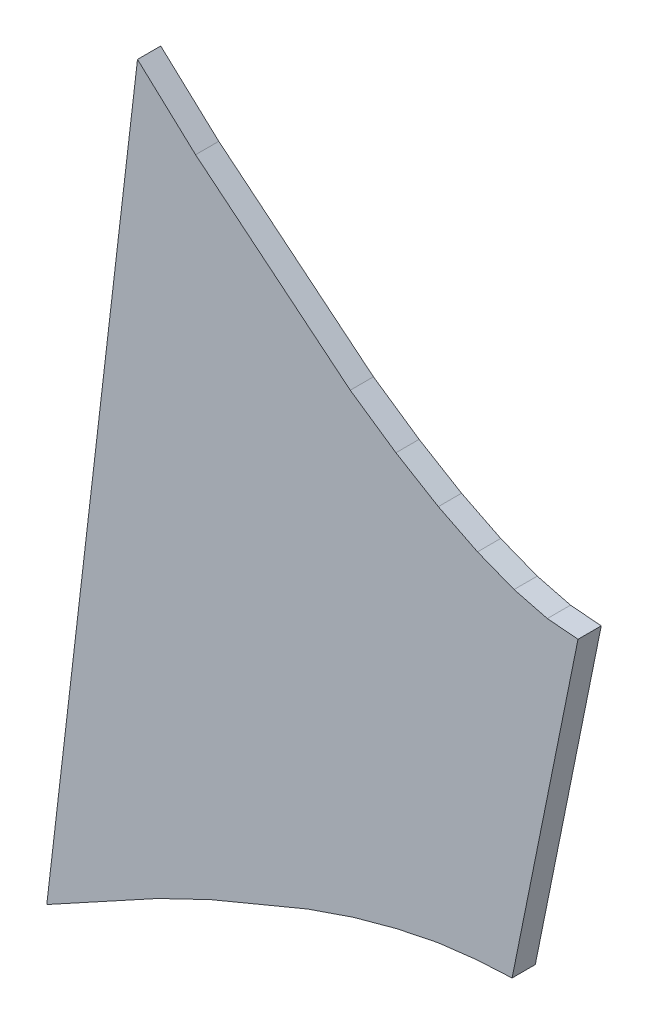
ISO-10303-21;
HEADER;
FILE_DESCRIPTION(('STEP AP214'),'2;1');
FILE_NAME('part.step','',(''),(''),'','','');
FILE_SCHEMA(('AUTOMOTIVE_DESIGN { 1 0 10303 214 1 1 1 1 }'));
ENDSEC;
DATA;
#1=APPLICATION_CONTEXT('core data for automotive mechanical design processes');
#2=APPLICATION_PROTOCOL_DEFINITION('international standard','automotive_design',2000,#1);
#3=PRODUCT_CONTEXT('',#1,'mechanical');
#4=PRODUCT('Part','Part','',(#3));
#5=PRODUCT_RELATED_PRODUCT_CATEGORY('part','',(#4));
#6=PRODUCT_DEFINITION_FORMATION('','',#4);
#7=PRODUCT_DEFINITION_CONTEXT('part definition',#1,'design');
#8=PRODUCT_DEFINITION('design','',#6,#7);
#9=PRODUCT_DEFINITION_SHAPE('','',#8);
#10=(LENGTH_UNIT() NAMED_UNIT(*) SI_UNIT(.MILLI.,.METRE.));
#11=(NAMED_UNIT(*) PLANE_ANGLE_UNIT() SI_UNIT($,.RADIAN.));
#12=(NAMED_UNIT(*) SI_UNIT($,.STERADIAN.) SOLID_ANGLE_UNIT());
#13=UNCERTAINTY_MEASURE_WITH_UNIT(LENGTH_MEASURE(1.E-05),#10,'distance_accuracy_value','');
#14=(GEOMETRIC_REPRESENTATION_CONTEXT(3) GLOBAL_UNCERTAINTY_ASSIGNED_CONTEXT((#13)) GLOBAL_UNIT_ASSIGNED_CONTEXT((#10,
#11,#12)) REPRESENTATION_CONTEXT('',''));
#15=CARTESIAN_POINT('',(0.,0.,0.));
#16=DIRECTION('',(0.,0.,1.));
#17=DIRECTION('',(1.,0.,0.));
#18=AXIS2_PLACEMENT_3D('',#15,#16,#17);
#19=CARTESIAN_POINT('',(95.0230026245117,96.8190002441406,0.));
#20=DIRECTION('',(-0.0847451700380124,-0.996402657641592,0.));
#21=DIRECTION('',(-0.996402657641592,0.0847451700380124,0.));
#22=AXIS2_PLACEMENT_3D('',#19,#20,#21);
#23=PLANE('',#22);
#24=DIRECTION('',(-0.996402657641592,0.0847451700380124,0.));
#25=VECTOR('',#24,1.);
#26=CARTESIAN_POINT('',(95.0230026245117,96.8190002441406,0.03556));
#27=LINE('',#26,#25);
#28=CARTESIAN_POINT('',(95.0230026245117,96.8190002441406,0.03556));
#29=VERTEX_POINT('',#28);
#30=CARTESIAN_POINT('',(94.9759979248047,96.822998046875,0.03556));
#31=VERTEX_POINT('',#30);
#32=EDGE_CURVE('E11',#29,#31,#27,.T.);
#33=ORIENTED_EDGE('',*,*,#32,.F.);
#34=DIRECTION('',(0.,0.,1.));
#35=VECTOR('',#34,1.);
#36=CARTESIAN_POINT('',(95.0230026245117,96.8190002441406,0.));
#37=LINE('',#36,#35);
#38=CARTESIAN_POINT('',(95.0230026245117,96.8190002441406,0.));
#39=VERTEX_POINT('',#38);
#40=EDGE_CURVE('E24',#39,#29,#37,.T.);
#41=ORIENTED_EDGE('',*,*,#40,.F.);
#42=DIRECTION('',(-0.996402657641592,0.0847451700380124,0.));
#43=VECTOR('',#42,1.);
#44=CARTESIAN_POINT('',(95.0230026245117,96.8190002441406,0.));
#45=LINE('',#44,#43);
#46=CARTESIAN_POINT('',(94.9759979248047,96.822998046875,0.));
#47=VERTEX_POINT('',#46);
#48=EDGE_CURVE('E160',#39,#47,#45,.T.);
#49=ORIENTED_EDGE('',*,*,#48,.T.);
#50=DIRECTION('',(0.,0.,1.));
#51=VECTOR('',#50,1.);
#52=CARTESIAN_POINT('',(94.9759979248047,96.822998046875,0.));
#53=LINE('',#52,#51);
#54=EDGE_CURVE('E37',#47,#31,#53,.T.);
#55=ORIENTED_EDGE('',*,*,#54,.T.);
#56=EDGE_LOOP('',(#33,#41,#49,#55));
#57=FACE_BOUND('',#56,.T.);
#58=ADVANCED_FACE('F17',(#57),#23,.F.);
#59=CARTESIAN_POINT('',(94.9759979248047,96.822998046875,0.));
#60=DIRECTION('',(-0.247035735310202,-0.96900637019565,0.));
#61=DIRECTION('',(-0.96900637019565,0.247035735310202,0.));
#62=AXIS2_PLACEMENT_3D('',#59,#60,#61);
#63=PLANE('',#62);
#64=DIRECTION('',(-0.96900637019565,0.247035735310202,0.));
#65=VECTOR('',#64,1.);
#66=CARTESIAN_POINT('',(94.9759979248047,96.822998046875,0.03556));
#67=LINE('',#66,#65);
#68=CARTESIAN_POINT('',(94.9250030517578,96.8359985351563,0.03556));
#69=VERTEX_POINT('',#68);
#70=EDGE_CURVE('E280',#31,#69,#67,.T.);
#71=ORIENTED_EDGE('',*,*,#70,.F.);
#72=ORIENTED_EDGE('',*,*,#54,.F.);
#73=DIRECTION('',(-0.96900637019565,0.247035735310202,0.));
#74=VECTOR('',#73,1.);
#75=CARTESIAN_POINT('',(94.9759979248047,96.822998046875,0.));
#76=LINE('',#75,#74);
#77=CARTESIAN_POINT('',(94.9250030517578,96.8359985351563,0.));
#78=VERTEX_POINT('',#77);
#79=EDGE_CURVE('E277',#47,#78,#76,.T.);
#80=ORIENTED_EDGE('',*,*,#79,.T.);
#81=DIRECTION('',(0.,0.,1.));
#82=VECTOR('',#81,1.);
#83=CARTESIAN_POINT('',(94.9250030517578,96.8359985351563,0.));
#84=LINE('',#83,#82);
#85=EDGE_CURVE('E275',#78,#69,#84,.T.);
#86=ORIENTED_EDGE('',*,*,#85,.T.);
#87=EDGE_LOOP('',(#71,#72,#80,#86));
#88=FACE_BOUND('',#87,.T.);
#89=ADVANCED_FACE('F288',(#88),#63,.F.);
#90=CARTESIAN_POINT('',(94.9250030517578,96.8359985351563,0.));
#91=DIRECTION('',(-0.365699450144398,-0.930732997246839,0.));
#92=DIRECTION('',(-0.930732997246839,0.365699450144398,0.));
#93=AXIS2_PLACEMENT_3D('',#90,#91,#92);
#94=PLANE('',#93);
#95=DIRECTION('',(-0.930732997246839,0.365699450144398,0.));
#96=VECTOR('',#95,1.);
#97=CARTESIAN_POINT('',(94.9250030517578,96.8359985351563,0.03556));
#98=LINE('',#97,#96);
#99=CARTESIAN_POINT('',(94.8690032958984,96.8580017089844,0.03556));
#100=VERTEX_POINT('',#99);
#101=EDGE_CURVE('E272',#69,#100,#98,.T.);
#102=ORIENTED_EDGE('',*,*,#101,.F.);
#103=ORIENTED_EDGE('',*,*,#85,.F.);
#104=DIRECTION('',(-0.930732997246839,0.365699450144398,0.));
#105=VECTOR('',#104,1.);
#106=CARTESIAN_POINT('',(94.9250030517578,96.8359985351563,0.));
#107=LINE('',#106,#105);
#108=CARTESIAN_POINT('',(94.8690032958984,96.8580017089844,0.));
#109=VERTEX_POINT('',#108);
#110=EDGE_CURVE('E269',#78,#109,#107,.T.);
#111=ORIENTED_EDGE('',*,*,#110,.T.);
#112=DIRECTION('',(0.,0.,1.));
#113=VECTOR('',#112,1.);
#114=CARTESIAN_POINT('',(94.8690032958984,96.8580017089844,0.));
#115=LINE('',#114,#113);
#116=EDGE_CURVE('E267',#109,#100,#115,.T.);
#117=ORIENTED_EDGE('',*,*,#116,.T.);
#118=EDGE_LOOP('',(#102,#103,#111,#117));
#119=FACE_BOUND('',#118,.T.);
#120=ADVANCED_FACE('F294',(#119),#94,.F.);
#121=CARTESIAN_POINT('',(94.8690032958984,96.8580017089844,0.));
#122=DIRECTION('',(-0.447168104778649,-0.894449934914566,0.));
#123=DIRECTION('',(-0.894449934914566,0.447168104778649,0.));
#124=AXIS2_PLACEMENT_3D('',#121,#122,#123);
#125=PLANE('',#124);
#126=DIRECTION('',(-0.894449934914566,0.447168104778649,0.));
#127=VECTOR('',#126,1.);
#128=CARTESIAN_POINT('',(94.8690032958984,96.8580017089844,0.03556));
#129=LINE('',#128,#127);
#130=CARTESIAN_POINT('',(94.8089981079102,96.8880004882812,0.03556));
#131=VERTEX_POINT('',#130);
#132=EDGE_CURVE('E264',#100,#131,#129,.T.);
#133=ORIENTED_EDGE('',*,*,#132,.F.);
#134=ORIENTED_EDGE('',*,*,#116,.F.);
#135=DIRECTION('',(-0.894449934914566,0.447168104778649,0.));
#136=VECTOR('',#135,1.);
#137=CARTESIAN_POINT('',(94.8690032958984,96.8580017089844,0.));
#138=LINE('',#137,#136);
#139=CARTESIAN_POINT('',(94.8089981079102,96.8880004882812,0.));
#140=VERTEX_POINT('',#139);
#141=EDGE_CURVE('E261',#109,#140,#138,.T.);
#142=ORIENTED_EDGE('',*,*,#141,.T.);
#143=DIRECTION('',(0.,0.,1.));
#144=VECTOR('',#143,1.);
#145=CARTESIAN_POINT('',(94.8089981079102,96.8880004882812,0.));
#146=LINE('',#145,#144);
#147=EDGE_CURVE('E259',#140,#131,#146,.T.);
#148=ORIENTED_EDGE('',*,*,#147,.T.);
#149=EDGE_LOOP('',(#133,#134,#142,#148));
#150=FACE_BOUND('',#149,.T.);
#151=ADVANCED_FACE('F296',(#150),#125,.F.);
#152=CARTESIAN_POINT('',(94.8089981079102,96.8880004882812,0.));
#153=DIRECTION('',(-0.514540160647674,-0.857466281016732,0.));
#154=DIRECTION('',(-0.857466281016732,0.514540160647674,0.));
#155=AXIS2_PLACEMENT_3D('',#152,#153,#154);
#156=PLANE('',#155);
#157=DIRECTION('',(-0.857466281016732,0.514540160647674,0.));
#158=VECTOR('',#157,1.);
#159=CARTESIAN_POINT('',(94.8089981079102,96.8880004882812,0.03556));
#160=LINE('',#159,#158);
#161=CARTESIAN_POINT('',(94.7440032958984,96.927001953125,0.03556));
#162=VERTEX_POINT('',#161);
#163=EDGE_CURVE('E256',#131,#162,#160,.T.);
#164=ORIENTED_EDGE('',*,*,#163,.F.);
#165=ORIENTED_EDGE('',*,*,#147,.F.);
#166=DIRECTION('',(-0.857466281016732,0.514540160647674,0.));
#167=VECTOR('',#166,1.);
#168=CARTESIAN_POINT('',(94.8089981079102,96.8880004882812,0.));
#169=LINE('',#168,#167);
#170=CARTESIAN_POINT('',(94.7440032958984,96.927001953125,0.));
#171=VERTEX_POINT('',#170);
#172=EDGE_CURVE('E253',#140,#171,#169,.T.);
#173=ORIENTED_EDGE('',*,*,#172,.T.);
#174=DIRECTION('',(0.,0.,1.));
#175=VECTOR('',#174,1.);
#176=CARTESIAN_POINT('',(94.7440032958984,96.927001953125,0.));
#177=LINE('',#176,#175);
#178=EDGE_CURVE('E251',#171,#162,#177,.T.);
#179=ORIENTED_EDGE('',*,*,#178,.T.);
#180=EDGE_LOOP('',(#164,#165,#173,#179));
#181=FACE_BOUND('',#180,.T.);
#182=ADVANCED_FACE('F301',(#181),#156,.F.);
#183=CARTESIAN_POINT('',(94.7440032958984,96.927001953125,0.));
#184=DIRECTION('',(-0.565502151713997,-0.824746819579705,0.));
#185=DIRECTION('',(-0.824746819579705,0.565502151713997,0.));
#186=AXIS2_PLACEMENT_3D('',#183,#184,#185);
#187=PLANE('',#186);
#188=DIRECTION('',(-0.824746819579705,0.565502151713997,0.));
#189=VECTOR('',#188,1.);
#190=CARTESIAN_POINT('',(94.7440032958984,96.927001953125,0.03556));
#191=LINE('',#190,#189);
#192=CARTESIAN_POINT('',(94.6740036010742,96.9749984741211,0.03556));
#193=VERTEX_POINT('',#192);
#194=EDGE_CURVE('E248',#162,#193,#191,.T.);
#195=ORIENTED_EDGE('',*,*,#194,.F.);
#196=ORIENTED_EDGE('',*,*,#178,.F.);
#197=DIRECTION('',(-0.824746819579705,0.565502151713997,0.));
#198=VECTOR('',#197,1.);
#199=CARTESIAN_POINT('',(94.7440032958984,96.927001953125,0.));
#200=LINE('',#199,#198);
#201=CARTESIAN_POINT('',(94.6740036010742,96.9749984741211,0.));
#202=VERTEX_POINT('',#201);
#203=EDGE_CURVE('E245',#171,#202,#200,.T.);
#204=ORIENTED_EDGE('',*,*,#203,.T.);
#205=DIRECTION('',(0.,0.,1.));
#206=VECTOR('',#205,1.);
#207=CARTESIAN_POINT('',(94.6740036010742,96.9749984741211,0.));
#208=LINE('',#207,#206);
#209=EDGE_CURVE('E243',#202,#193,#208,.T.);
#210=ORIENTED_EDGE('',*,*,#209,.T.);
#211=EDGE_LOOP('',(#195,#196,#204,#210));
#212=FACE_BOUND('',#211,.T.);
#213=ADVANCED_FACE('F304',(#212),#187,.F.);
#214=CARTESIAN_POINT('',(94.6740036010742,96.9749984741211,0.));
#215=DIRECTION('',(-0.633404621409799,-0.773820770964898,0.));
#216=DIRECTION('',(-0.773820770964898,0.633404621409799,0.));
#217=AXIS2_PLACEMENT_3D('',#214,#215,#216);
#218=PLANE('',#217);
#219=DIRECTION('',(-0.773820770964898,0.633404621409799,0.));
#220=VECTOR('',#219,1.);
#221=CARTESIAN_POINT('',(94.6740036010742,96.9749984741211,0.03556));
#222=LINE('',#221,#220);
#223=CARTESIAN_POINT('',(94.4369964599609,97.1689987182617,0.03556));
#224=VERTEX_POINT('',#223);
#225=EDGE_CURVE('E240',#193,#224,#222,.T.);
#226=ORIENTED_EDGE('',*,*,#225,.F.);
#227=ORIENTED_EDGE('',*,*,#209,.F.);
#228=DIRECTION('',(-0.773820770964898,0.633404621409799,0.));
#229=VECTOR('',#228,1.);
#230=CARTESIAN_POINT('',(94.6740036010742,96.9749984741211,0.));
#231=LINE('',#230,#229);
#232=CARTESIAN_POINT('',(94.4369964599609,97.1689987182617,0.));
#233=VERTEX_POINT('',#232);
#234=EDGE_CURVE('E237',#202,#233,#231,.T.);
#235=ORIENTED_EDGE('',*,*,#234,.T.);
#236=DIRECTION('',(0.,0.,1.));
#237=VECTOR('',#236,1.);
#238=CARTESIAN_POINT('',(94.4369964599609,97.1689987182617,0.));
#239=LINE('',#238,#237);
#240=EDGE_CURVE('E235',#233,#224,#239,.T.);
#241=ORIENTED_EDGE('',*,*,#240,.T.);
#242=EDGE_LOOP('',(#226,#227,#235,#241));
#243=FACE_BOUND('',#242,.T.);
#244=ADVANCED_FACE('F309',(#243),#218,.F.);
#245=CARTESIAN_POINT('',(94.4369964599609,97.1689987182617,0.));
#246=DIRECTION('',(-0.677609487184007,-0.735421908076056,0.));
#247=DIRECTION('',(-0.735421908076056,0.677609487184007,0.));
#248=AXIS2_PLACEMENT_3D('',#245,#246,#247);
#249=PLANE('',#248);
#250=DIRECTION('',(-0.735421908076056,0.677609487184007,0.));
#251=VECTOR('',#250,1.);
#252=CARTESIAN_POINT('',(94.4369964599609,97.1689987182617,0.03556));
#253=LINE('',#252,#251);
#254=CARTESIAN_POINT('',(94.3479995727539,97.2509994506836,0.03556));
#255=VERTEX_POINT('',#254);
#256=EDGE_CURVE('E232',#224,#255,#253,.T.);
#257=ORIENTED_EDGE('',*,*,#256,.F.);
#258=ORIENTED_EDGE('',*,*,#240,.F.);
#259=DIRECTION('',(-0.735421908076056,0.677609487184007,0.));
#260=VECTOR('',#259,1.);
#261=CARTESIAN_POINT('',(94.4369964599609,97.1689987182617,0.));
#262=LINE('',#261,#260);
#263=CARTESIAN_POINT('',(94.3479995727539,97.2509994506836,0.));
#264=VERTEX_POINT('',#263);
#265=EDGE_CURVE('E229',#233,#264,#262,.T.);
#266=ORIENTED_EDGE('',*,*,#265,.T.);
#267=DIRECTION('',(0.,0.,1.));
#268=VECTOR('',#267,1.);
#269=CARTESIAN_POINT('',(94.3479995727539,97.2509994506836,0.));
#270=LINE('',#269,#268);
#271=EDGE_CURVE('E227',#264,#255,#270,.T.);
#272=ORIENTED_EDGE('',*,*,#271,.T.);
#273=EDGE_LOOP('',(#257,#258,#266,#272));
#274=FACE_BOUND('',#273,.T.);
#275=ADVANCED_FACE('F312',(#274),#249,.F.);
#276=CARTESIAN_POINT('',(94.3479995727539,97.2509994506836,0.));
#277=DIRECTION('',(0.993258365801475,-0.115921606119758,0.));
#278=DIRECTION('',(-0.115921606119758,-0.993258365801475,0.));
#279=AXIS2_PLACEMENT_3D('',#276,#277,#278);
#280=PLANE('',#279);
#281=DIRECTION('',(-0.115921606119758,-0.993258365801475,0.));
#282=VECTOR('',#281,1.);
#283=CARTESIAN_POINT('',(94.3479995727539,97.2509994506836,0.03556));
#284=LINE('',#283,#282);
#285=CARTESIAN_POINT('',(94.208999633789,96.0599975585938,0.03556));
#286=VERTEX_POINT('',#285);
#287=EDGE_CURVE('E224',#255,#286,#284,.T.);
#288=ORIENTED_EDGE('',*,*,#287,.F.);
#289=ORIENTED_EDGE('',*,*,#271,.F.);
#290=DIRECTION('',(-0.115921606119758,-0.993258365801475,0.));
#291=VECTOR('',#290,1.);
#292=CARTESIAN_POINT('',(94.3479995727539,97.2509994506836,0.));
#293=LINE('',#292,#291);
#294=CARTESIAN_POINT('',(94.208999633789,96.0599975585938,0.));
#295=VERTEX_POINT('',#294);
#296=EDGE_CURVE('E221',#264,#295,#293,.T.);
#297=ORIENTED_EDGE('',*,*,#296,.T.);
#298=DIRECTION('',(0.,0.,1.));
#299=VECTOR('',#298,1.);
#300=CARTESIAN_POINT('',(94.208999633789,96.0599975585938,0.));
#301=LINE('',#300,#299);
#302=EDGE_CURVE('E219',#295,#286,#301,.T.);
#303=ORIENTED_EDGE('',*,*,#302,.T.);
#304=EDGE_LOOP('',(#288,#289,#297,#303));
#305=FACE_BOUND('',#304,.T.);
#306=ADVANCED_FACE('F317',(#305),#280,.F.);
#307=CARTESIAN_POINT('',(94.208999633789,96.0599975585938,0.));
#308=DIRECTION('',(-0.479949669633047,0.877296024508905,0.));
#309=DIRECTION('',(0.877296024508905,0.479949669633047,0.));
#310=AXIS2_PLACEMENT_3D('',#307,#308,#309);
#311=PLANE('',#310);
#312=DIRECTION('',(0.877296024508905,0.479949669633047,0.));
#313=VECTOR('',#312,1.);
#314=CARTESIAN_POINT('',(94.208999633789,96.0599975585938,0.03556));
#315=LINE('',#314,#313);
#316=CARTESIAN_POINT('',(94.3789978027344,96.1529998779297,0.03556));
#317=VERTEX_POINT('',#316);
#318=EDGE_CURVE('E216',#286,#317,#315,.T.);
#319=ORIENTED_EDGE('',*,*,#318,.F.);
#320=ORIENTED_EDGE('',*,*,#302,.F.);
#321=DIRECTION('',(0.877296024508905,0.479949669633047,0.));
#322=VECTOR('',#321,1.);
#323=CARTESIAN_POINT('',(94.208999633789,96.0599975585938,0.));
#324=LINE('',#323,#322);
#325=CARTESIAN_POINT('',(94.3789978027344,96.1529998779297,0.));
#326=VERTEX_POINT('',#325);
#327=EDGE_CURVE('E213',#295,#326,#324,.T.);
#328=ORIENTED_EDGE('',*,*,#327,.T.);
#329=DIRECTION('',(0.,0.,1.));
#330=VECTOR('',#329,1.);
#331=CARTESIAN_POINT('',(94.3789978027344,96.1529998779297,0.));
#332=LINE('',#331,#330);
#333=EDGE_CURVE('E211',#326,#317,#332,.T.);
#334=ORIENTED_EDGE('',*,*,#333,.T.);
#335=EDGE_LOOP('',(#319,#320,#328,#334));
#336=FACE_BOUND('',#335,.T.);
#337=ADVANCED_FACE('F320',(#336),#311,.F.);
#338=CARTESIAN_POINT('',(94.3789978027344,96.1529998779297,0.));
#339=DIRECTION('',(-0.433823273501475,0.90099798410899,0.));
#340=DIRECTION('',(0.90099798410899,0.433823273501475,0.));
#341=AXIS2_PLACEMENT_3D('',#338,#339,#340);
#342=PLANE('',#341);
#343=DIRECTION('',(0.90099798410899,0.433823273501475,0.));
#344=VECTOR('',#343,1.);
#345=CARTESIAN_POINT('',(94.3789978027344,96.1529998779297,0.03556));
#346=LINE('',#345,#344);
#347=CARTESIAN_POINT('',(94.4599990844727,96.1920013427734,0.03556));
#348=VERTEX_POINT('',#347);
#349=EDGE_CURVE('E208',#317,#348,#346,.T.);
#350=ORIENTED_EDGE('',*,*,#349,.F.);
#351=ORIENTED_EDGE('',*,*,#333,.F.);
#352=DIRECTION('',(0.90099798410899,0.433823273501475,0.));
#353=VECTOR('',#352,1.);
#354=CARTESIAN_POINT('',(94.3789978027344,96.1529998779297,0.));
#355=LINE('',#354,#353);
#356=CARTESIAN_POINT('',(94.4599990844727,96.1920013427734,0.));
#357=VERTEX_POINT('',#356);
#358=EDGE_CURVE('E205',#326,#357,#355,.T.);
#359=ORIENTED_EDGE('',*,*,#358,.T.);
#360=DIRECTION('',(0.,0.,1.));
#361=VECTOR('',#360,1.);
#362=CARTESIAN_POINT('',(94.4599990844727,96.1920013427734,0.));
#363=LINE('',#362,#361);
#364=EDGE_CURVE('E203',#357,#348,#363,.T.);
#365=ORIENTED_EDGE('',*,*,#364,.T.);
#366=EDGE_LOOP('',(#350,#351,#359,#365));
#367=FACE_BOUND('',#366,.T.);
#368=ADVANCED_FACE('F325',(#367),#342,.F.);
#369=CARTESIAN_POINT('',(94.4599990844727,96.1920013427734,0.));
#370=DIRECTION('',(-0.384152102614917,0.923269820830584,0.));
#371=DIRECTION('',(0.923269820830584,0.384152102614917,0.));
#372=AXIS2_PLACEMENT_3D('',#369,#370,#371);
#373=PLANE('',#372);
#374=DIRECTION('',(0.923269820830584,0.384152102614917,0.));
#375=VECTOR('',#374,1.);
#376=CARTESIAN_POINT('',(94.4599990844727,96.1920013427734,0.03556));
#377=LINE('',#376,#375);
#378=CARTESIAN_POINT('',(94.609001159668,96.2539978027344,0.03556));
#379=VERTEX_POINT('',#378);
#380=EDGE_CURVE('E200',#348,#379,#377,.T.);
#381=ORIENTED_EDGE('',*,*,#380,.F.);
#382=ORIENTED_EDGE('',*,*,#364,.F.);
#383=DIRECTION('',(0.923269820830584,0.384152102614917,0.));
#384=VECTOR('',#383,1.);
#385=CARTESIAN_POINT('',(94.4599990844727,96.1920013427734,0.));
#386=LINE('',#385,#384);
#387=CARTESIAN_POINT('',(94.609001159668,96.2539978027344,0.));
#388=VERTEX_POINT('',#387);
#389=EDGE_CURVE('E197',#357,#388,#386,.T.);
#390=ORIENTED_EDGE('',*,*,#389,.T.);
#391=DIRECTION('',(0.,0.,1.));
#392=VECTOR('',#391,1.);
#393=CARTESIAN_POINT('',(94.609001159668,96.2539978027344,0.));
#394=LINE('',#393,#392);
#395=EDGE_CURVE('E195',#388,#379,#394,.T.);
#396=ORIENTED_EDGE('',*,*,#395,.T.);
#397=EDGE_LOOP('',(#381,#382,#390,#396));
#398=FACE_BOUND('',#397,.T.);
#399=ADVANCED_FACE('F328',(#398),#373,.F.);
#400=CARTESIAN_POINT('',(94.609001159668,96.2539978027344,0.));
#401=DIRECTION('',(-0.324350682698558,0.945936908378661,0.));
#402=DIRECTION('',(0.945936908378661,0.324350682698558,0.));
#403=AXIS2_PLACEMENT_3D('',#400,#401,#402);
#404=PLANE('',#403);
#405=DIRECTION('',(0.945936908378661,0.324350682698558,0.));
#406=VECTOR('',#405,1.);
#407=CARTESIAN_POINT('',(94.609001159668,96.2539978027344,0.03556));
#408=LINE('',#407,#406);
#409=CARTESIAN_POINT('',(94.6790008544922,96.2779998779297,0.03556));
#410=VERTEX_POINT('',#409);
#411=EDGE_CURVE('E192',#379,#410,#408,.T.);
#412=ORIENTED_EDGE('',*,*,#411,.F.);
#413=ORIENTED_EDGE('',*,*,#395,.F.);
#414=DIRECTION('',(0.945936908378661,0.324350682698558,0.));
#415=VECTOR('',#414,1.);
#416=CARTESIAN_POINT('',(94.609001159668,96.2539978027344,0.));
#417=LINE('',#416,#415);
#418=CARTESIAN_POINT('',(94.6790008544922,96.2779998779297,0.));
#419=VERTEX_POINT('',#418);
#420=EDGE_CURVE('E189',#388,#419,#417,.T.);
#421=ORIENTED_EDGE('',*,*,#420,.T.);
#422=DIRECTION('',(0.,0.,1.));
#423=VECTOR('',#422,1.);
#424=CARTESIAN_POINT('',(94.6790008544922,96.2779998779297,0.));
#425=LINE('',#424,#423);
#426=EDGE_CURVE('E187',#419,#410,#425,.T.);
#427=ORIENTED_EDGE('',*,*,#426,.T.);
#428=EDGE_LOOP('',(#412,#413,#421,#427));
#429=FACE_BOUND('',#428,.T.);
#430=ADVANCED_FACE('F333',(#429),#404,.F.);
#431=CARTESIAN_POINT('',(94.6790008544922,96.2779998779297,0.));
#432=DIRECTION('',(-0.263079659788953,0.964774114808917,0.));
#433=DIRECTION('',(0.964774114808917,0.263079659788953,0.));
#434=AXIS2_PLACEMENT_3D('',#431,#432,#433);
#435=PLANE('',#434);
#436=DIRECTION('',(0.964774114808917,0.263079659788953,0.));
#437=VECTOR('',#436,1.);
#438=CARTESIAN_POINT('',(94.6790008544922,96.2779998779297,0.03556));
#439=LINE('',#438,#437);
#440=CARTESIAN_POINT('',(94.745002746582,96.2959976196289,0.03556));
#441=VERTEX_POINT('',#440);
#442=EDGE_CURVE('E184',#410,#441,#439,.T.);
#443=ORIENTED_EDGE('',*,*,#442,.F.);
#444=ORIENTED_EDGE('',*,*,#426,.F.);
#445=DIRECTION('',(0.964774114808917,0.263079659788953,0.));
#446=VECTOR('',#445,1.);
#447=CARTESIAN_POINT('',(94.6790008544922,96.2779998779297,0.));
#448=LINE('',#447,#446);
#449=CARTESIAN_POINT('',(94.745002746582,96.2959976196289,0.));
#450=VERTEX_POINT('',#449);
#451=EDGE_CURVE('E181',#419,#450,#448,.T.);
#452=ORIENTED_EDGE('',*,*,#451,.T.);
#453=DIRECTION('',(0.,0.,1.));
#454=VECTOR('',#453,1.);
#455=CARTESIAN_POINT('',(94.745002746582,96.2959976196289,0.));
#456=LINE('',#455,#454);
#457=EDGE_CURVE('E179',#450,#441,#456,.T.);
#458=ORIENTED_EDGE('',*,*,#457,.T.);
#459=EDGE_LOOP('',(#443,#444,#452,#458));
#460=FACE_BOUND('',#459,.T.);
#461=ADVANCED_FACE('F336',(#460),#435,.F.);
#462=CARTESIAN_POINT('',(94.745002746582,96.2959976196289,0.));
#463=DIRECTION('',(-0.202111392560324,0.979362540123588,0.));
#464=DIRECTION('',(0.979362540123588,0.202111392560324,0.));
#465=AXIS2_PLACEMENT_3D('',#462,#463,#464);
#466=PLANE('',#465);
#467=DIRECTION('',(0.979362540123588,0.202111392560324,0.));
#468=VECTOR('',#467,1.);
#469=CARTESIAN_POINT('',(94.745002746582,96.2959976196289,0.03556));
#470=LINE('',#469,#468);
#471=CARTESIAN_POINT('',(94.8079986572266,96.3089981079102,0.03556));
#472=VERTEX_POINT('',#471);
#473=EDGE_CURVE('E176',#441,#472,#470,.T.);
#474=ORIENTED_EDGE('',*,*,#473,.F.);
#475=ORIENTED_EDGE('',*,*,#457,.F.);
#476=DIRECTION('',(0.979362540123588,0.202111392560324,0.));
#477=VECTOR('',#476,1.);
#478=CARTESIAN_POINT('',(94.745002746582,96.2959976196289,0.));
#479=LINE('',#478,#477);
#480=CARTESIAN_POINT('',(94.8079986572266,96.3089981079102,0.));
#481=VERTEX_POINT('',#480);
#482=EDGE_CURVE('E173',#450,#481,#479,.T.);
#483=ORIENTED_EDGE('',*,*,#482,.T.);
#484=DIRECTION('',(0.,0.,1.));
#485=VECTOR('',#484,1.);
#486=CARTESIAN_POINT('',(94.8079986572266,96.3089981079102,0.));
#487=LINE('',#486,#485);
#488=EDGE_CURVE('E171',#481,#472,#487,.T.);
#489=ORIENTED_EDGE('',*,*,#488,.T.);
#490=EDGE_LOOP('',(#474,#475,#483,#489));
#491=FACE_BOUND('',#490,.T.);
#492=ADVANCED_FACE('F341',(#491),#466,.F.);
#493=CARTESIAN_POINT('',(94.8079986572266,96.3089981079102,0.));
#494=DIRECTION('',(-0.11788427492549,0.993027339867987,0.));
#495=DIRECTION('',(0.993027339867987,0.11788427492549,0.));
#496=AXIS2_PLACEMENT_3D('',#493,#494,#495);
#497=PLANE('',#496);
#498=DIRECTION('',(0.993027339867987,0.11788427492549,0.));
#499=VECTOR('',#498,1.);
#500=CARTESIAN_POINT('',(94.8079986572266,96.3089981079102,0.03556));
#501=LINE('',#500,#499);
#502=CARTESIAN_POINT('',(94.8669967651367,96.3160018920898,0.03556));
#503=VERTEX_POINT('',#502);
#504=EDGE_CURVE('E168',#472,#503,#501,.T.);
#505=ORIENTED_EDGE('',*,*,#504,.F.);
#506=ORIENTED_EDGE('',*,*,#488,.F.);
#507=DIRECTION('',(0.993027339867987,0.11788427492549,0.));
#508=VECTOR('',#507,1.);
#509=CARTESIAN_POINT('',(94.8079986572266,96.3089981079102,0.));
#510=LINE('',#509,#508);
#511=CARTESIAN_POINT('',(94.8669967651367,96.3160018920898,0.));
#512=VERTEX_POINT('',#511);
#513=EDGE_CURVE('E166',#481,#512,#510,.T.);
#514=ORIENTED_EDGE('',*,*,#513,.T.);
#515=DIRECTION('',(0.,0.,1.));
#516=VECTOR('',#515,1.);
#517=CARTESIAN_POINT('',(94.8669967651367,96.3160018920898,0.));
#518=LINE('',#517,#516);
#519=EDGE_CURVE('E151',#512,#503,#518,.T.);
#520=ORIENTED_EDGE('',*,*,#519,.T.);
#521=EDGE_LOOP('',(#505,#506,#514,#520));
#522=FACE_BOUND('',#521,.T.);
#523=ADVANCED_FACE('F343',(#522),#497,.F.);
#524=CARTESIAN_POINT('',(94.8669967651367,96.3160018920898,0.));
#525=DIRECTION('',(-0.0544343624539381,0.998517350968041,0.));
#526=DIRECTION('',(0.998517350968041,0.0544343624539381,0.));
#527=AXIS2_PLACEMENT_3D('',#524,#525,#526);
#528=PLANE('',#527);
#529=DIRECTION('',(0.998517350968041,0.0544343624539381,0.));
#530=VECTOR('',#529,1.);
#531=CARTESIAN_POINT('',(94.8669967651367,96.3160018920898,0.03556));
#532=LINE('',#531,#530);
#533=CARTESIAN_POINT('',(94.9219970703125,96.3190002441406,0.03556));
#534=VERTEX_POINT('',#533);
#535=EDGE_CURVE('E155',#503,#534,#532,.T.);
#536=ORIENTED_EDGE('',*,*,#535,.F.);
#537=ORIENTED_EDGE('',*,*,#519,.F.);
#538=DIRECTION('',(0.998517350968041,0.0544343624539381,0.));
#539=VECTOR('',#538,1.);
#540=CARTESIAN_POINT('',(94.8669967651367,96.3160018920898,0.));
#541=LINE('',#540,#539);
#542=CARTESIAN_POINT('',(94.9219970703125,96.3190002441406,0.));
#543=VERTEX_POINT('',#542);
#544=EDGE_CURVE('E147',#512,#543,#541,.T.);
#545=ORIENTED_EDGE('',*,*,#544,.T.);
#546=DIRECTION('',(0.,0.,1.));
#547=VECTOR('',#546,1.);
#548=CARTESIAN_POINT('',(94.9219970703125,96.3190002441406,0.));
#549=LINE('',#548,#547);
#550=EDGE_CURVE('E137',#543,#534,#549,.T.);
#551=ORIENTED_EDGE('',*,*,#550,.T.);
#552=EDGE_LOOP('',(#536,#537,#545,#551));
#553=FACE_BOUND('',#552,.T.);
#554=ADVANCED_FACE('F150',(#553),#528,.F.);
#555=CARTESIAN_POINT('',(94.9219970703125,96.3190002441406,0.));
#556=DIRECTION('',(-0.980199749875365,0.198011237924194,0.));
#557=DIRECTION('',(0.198011237924194,0.980199749875365,0.));
#558=AXIS2_PLACEMENT_3D('',#555,#556,#557);
#559=PLANE('',#558);
#560=DIRECTION('',(0.198011237924194,0.980199749875365,0.));
#561=VECTOR('',#560,1.);
#562=CARTESIAN_POINT('',(94.9219970703125,96.3190002441406,0.03556));
#563=LINE('',#562,#561);
#564=EDGE_CURVE('E143',#534,#29,#563,.T.);
#565=ORIENTED_EDGE('',*,*,#564,.F.);
#566=ORIENTED_EDGE('',*,*,#550,.F.);
#567=DIRECTION('',(0.198011237924194,0.980199749875365,0.));
#568=VECTOR('',#567,1.);
#569=CARTESIAN_POINT('',(94.9219970703125,96.3190002441406,0.));
#570=LINE('',#569,#568);
#571=EDGE_CURVE('E141',#543,#39,#570,.T.);
#572=ORIENTED_EDGE('',*,*,#571,.T.);
#573=ORIENTED_EDGE('',*,*,#40,.T.);
#574=EDGE_LOOP('',(#565,#566,#572,#573));
#575=FACE_BOUND('',#574,.T.);
#576=ADVANCED_FACE('F139',(#575),#559,.F.);
#577=CARTESIAN_POINT('',(95.0230026245117,96.8190002441406,0.));
#578=DIRECTION('',(0.,0.,1.));
#579=DIRECTION('',(1.,0.,0.));
#580=AXIS2_PLACEMENT_3D('',#577,#578,#579);
#581=PLANE('',#580);
#582=ORIENTED_EDGE('',*,*,#571,.F.);
#583=ORIENTED_EDGE('',*,*,#544,.F.);
#584=ORIENTED_EDGE('',*,*,#513,.F.);
#585=ORIENTED_EDGE('',*,*,#482,.F.);
#586=ORIENTED_EDGE('',*,*,#451,.F.);
#587=ORIENTED_EDGE('',*,*,#420,.F.);
#588=ORIENTED_EDGE('',*,*,#389,.F.);
#589=ORIENTED_EDGE('',*,*,#358,.F.);
#590=ORIENTED_EDGE('',*,*,#327,.F.);
#591=ORIENTED_EDGE('',*,*,#296,.F.);
#592=ORIENTED_EDGE('',*,*,#265,.F.);
#593=ORIENTED_EDGE('',*,*,#234,.F.);
#594=ORIENTED_EDGE('',*,*,#203,.F.);
#595=ORIENTED_EDGE('',*,*,#172,.F.);
#596=ORIENTED_EDGE('',*,*,#141,.F.);
#597=ORIENTED_EDGE('',*,*,#110,.F.);
#598=ORIENTED_EDGE('',*,*,#79,.F.);
#599=ORIENTED_EDGE('',*,*,#48,.F.);
#600=EDGE_LOOP('',(#582,#583,#584,#585,#586,#587,#588,#589,#590,#591,#592,#593,#594,#595,#596,
#597,#598,#599));
#601=FACE_BOUND('',#600,.T.);
#602=ADVANCED_FACE('F158',(#601),#581,.F.);
#603=CARTESIAN_POINT('',(95.0230026245117,96.8190002441406,0.03556));
#604=DIRECTION('',(0.,0.,1.));
#605=DIRECTION('',(1.,0.,0.));
#606=AXIS2_PLACEMENT_3D('',#603,#604,#605);
#607=PLANE('',#606);
#608=ORIENTED_EDGE('',*,*,#32,.T.);
#609=ORIENTED_EDGE('',*,*,#70,.T.);
#610=ORIENTED_EDGE('',*,*,#101,.T.);
#611=ORIENTED_EDGE('',*,*,#132,.T.);
#612=ORIENTED_EDGE('',*,*,#163,.T.);
#613=ORIENTED_EDGE('',*,*,#194,.T.);
#614=ORIENTED_EDGE('',*,*,#225,.T.);
#615=ORIENTED_EDGE('',*,*,#256,.T.);
#616=ORIENTED_EDGE('',*,*,#287,.T.);
#617=ORIENTED_EDGE('',*,*,#318,.T.);
#618=ORIENTED_EDGE('',*,*,#349,.T.);
#619=ORIENTED_EDGE('',*,*,#380,.T.);
#620=ORIENTED_EDGE('',*,*,#411,.T.);
#621=ORIENTED_EDGE('',*,*,#442,.T.);
#622=ORIENTED_EDGE('',*,*,#473,.T.);
#623=ORIENTED_EDGE('',*,*,#504,.T.);
#624=ORIENTED_EDGE('',*,*,#535,.T.);
#625=ORIENTED_EDGE('',*,*,#564,.T.);
#626=EDGE_LOOP('',(#608,#609,#610,#611,#612,#613,#614,#615,#616,#617,#618,#619,#620,#621,#622,
#623,#624,#625));
#627=FACE_BOUND('',#626,.T.);
#628=ADVANCED_FACE('F291',(#627),#607,.T.);
#629=CLOSED_SHELL('',(#58,#89,#120,#151,#182,#213,#244,#275,#306,#337,#368,#399,#430,#461,#492,
#523,#554,#576,#602,#628));
#630=MANIFOLD_SOLID_BREP('B1',#629);
#631=ADVANCED_BREP_SHAPE_REPRESENTATION('',(#18,#630),#14);
#632=SHAPE_DEFINITION_REPRESENTATION(#9,#631);
ENDSEC;
END-ISO-10303-21;
